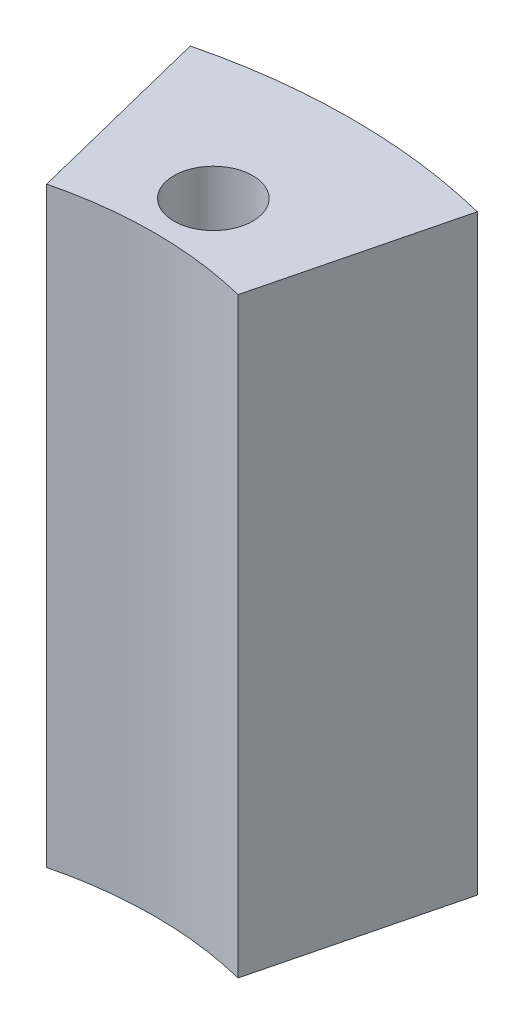
ISO-10303-21;
HEADER;
FILE_DESCRIPTION(('STEP AP214'),'2;1');
FILE_NAME('part.step','',(''),(''),'','','');
FILE_SCHEMA(('AUTOMOTIVE_DESIGN { 1 0 10303 214 1 1 1 1 }'));
ENDSEC;
DATA;
#1=APPLICATION_CONTEXT('core data for automotive mechanical design processes');
#2=APPLICATION_PROTOCOL_DEFINITION('international standard','automotive_design',2000,#1);
#3=PRODUCT_CONTEXT('',#1,'mechanical');
#4=PRODUCT('Part','Part','',(#3));
#5=PRODUCT_RELATED_PRODUCT_CATEGORY('part','',(#4));
#6=PRODUCT_DEFINITION_FORMATION('','',#4);
#7=PRODUCT_DEFINITION_CONTEXT('part definition',#1,'design');
#8=PRODUCT_DEFINITION('design','',#6,#7);
#9=PRODUCT_DEFINITION_SHAPE('','',#8);
#10=(LENGTH_UNIT() NAMED_UNIT(*) SI_UNIT(.MILLI.,.METRE.));
#11=(NAMED_UNIT(*) PLANE_ANGLE_UNIT() SI_UNIT($,.RADIAN.));
#12=(NAMED_UNIT(*) SI_UNIT($,.STERADIAN.) SOLID_ANGLE_UNIT());
#13=UNCERTAINTY_MEASURE_WITH_UNIT(LENGTH_MEASURE(1.E-05),#10,'distance_accuracy_value','');
#14=(GEOMETRIC_REPRESENTATION_CONTEXT(3) GLOBAL_UNCERTAINTY_ASSIGNED_CONTEXT((#13)) GLOBAL_UNIT_ASSIGNED_CONTEXT((#10,
#11,#12)) REPRESENTATION_CONTEXT('',''));
#15=CARTESIAN_POINT('',(0.,0.,0.));
#16=DIRECTION('',(0.,0.,1.));
#17=DIRECTION('',(1.,0.,0.));
#18=AXIS2_PLACEMENT_3D('',#15,#16,#17);
#19=CARTESIAN_POINT('',(0.,30.,0.));
#20=DIRECTION('',(0.,-1.,0.));
#21=DIRECTION('',(0.,0.,-1.));
#22=AXIS2_PLACEMENT_3D('',#19,#20,#21);
#23=CYLINDRICAL_SURFACE('',#22,20.);
#24=CARTESIAN_POINT('',(0.,0.,0.));
#25=DIRECTION('',(0.,-1.,0.));
#26=DIRECTION('',(0.,0.,1.));
#27=AXIS2_PLACEMENT_3D('',#24,#25,#26);
#28=CIRCLE('',#27,20.);
#29=CARTESIAN_POINT('',(-4.85071250072666,0.,-19.4028500029066));
#30=VERTEX_POINT('',#29);
#31=CARTESIAN_POINT('',(4.85071250072666,0.,-19.4028500029066));
#32=VERTEX_POINT('',#31);
#33=EDGE_CURVE('E100',#30,#32,#28,.T.);
#34=ORIENTED_EDGE('',*,*,#33,.T.);
#35=DIRECTION('',(0.,-1.,0.));
#36=VECTOR('',#35,1.);
#37=CARTESIAN_POINT('',(4.85071250072666,30.,-19.4028500029066));
#38=LINE('',#37,#36);
#39=CARTESIAN_POINT('',(4.85071250072666,30.,-19.4028500029066));
#40=VERTEX_POINT('',#39);
#41=EDGE_CURVE('E11',#40,#32,#38,.T.);
#42=ORIENTED_EDGE('',*,*,#41,.F.);
#43=CARTESIAN_POINT('',(0.,30.,0.));
#44=DIRECTION('',(0.,-1.,0.));
#45=DIRECTION('',(0.,0.,1.));
#46=AXIS2_PLACEMENT_3D('',#43,#44,#45);
#47=CIRCLE('',#46,20.);
#48=CARTESIAN_POINT('',(-4.85071250072666,30.,-19.4028500029066));
#49=VERTEX_POINT('',#48);
#50=EDGE_CURVE('E88',#49,#40,#47,.T.);
#51=ORIENTED_EDGE('',*,*,#50,.F.);
#52=DIRECTION('',(0.,-1.,0.));
#53=VECTOR('',#52,1.);
#54=CARTESIAN_POINT('',(-4.85071250072666,30.,-19.4028500029066));
#55=LINE('',#54,#53);
#56=EDGE_CURVE('E96',#49,#30,#55,.T.);
#57=ORIENTED_EDGE('',*,*,#56,.T.);
#58=EDGE_LOOP('',(#34,#42,#51,#57));
#59=FACE_BOUND('',#58,.T.);
#60=ADVANCED_FACE('F37',(#59),#23,.F.);
#61=CARTESIAN_POINT('',(4.85071250072666,30.,-19.4028500029066));
#62=DIRECTION('',(-0.970142500145332,0.,-0.242535625036333));
#63=DIRECTION('',(-0.242535625036333,0.,0.970142500145332));
#64=AXIS2_PLACEMENT_3D('',#61,#62,#63);
#65=PLANE('',#64);
#66=DIRECTION('',(0.242535625036333,0.,-0.970142500145332));
#67=VECTOR('',#66,1.);
#68=CARTESIAN_POINT('',(4.85071250072666,0.,-19.4028500029066));
#69=LINE('',#68,#67);
#70=CARTESIAN_POINT('',(7.27606875108998,0.,-29.10427500436));
#71=VERTEX_POINT('',#70);
#72=EDGE_CURVE('E92',#32,#71,#69,.T.);
#73=ORIENTED_EDGE('',*,*,#72,.T.);
#74=DIRECTION('',(0.,-1.,0.));
#75=VECTOR('',#74,1.);
#76=CARTESIAN_POINT('',(7.27606875108998,30.,-29.10427500436));
#77=LINE('',#76,#75);
#78=CARTESIAN_POINT('',(7.27606875108998,30.,-29.10427500436));
#79=VERTEX_POINT('',#78);
#80=EDGE_CURVE('E45',#79,#71,#77,.T.);
#81=ORIENTED_EDGE('',*,*,#80,.F.);
#82=DIRECTION('',(0.242535625036333,0.,-0.970142500145332));
#83=VECTOR('',#82,1.);
#84=CARTESIAN_POINT('',(4.85071250072666,30.,-19.4028500029066));
#85=LINE('',#84,#83);
#86=EDGE_CURVE('E83',#40,#79,#85,.T.);
#87=ORIENTED_EDGE('',*,*,#86,.F.);
#88=ORIENTED_EDGE('',*,*,#41,.T.);
#89=EDGE_LOOP('',(#73,#81,#87,#88));
#90=FACE_BOUND('',#89,.T.);
#91=ADVANCED_FACE('F91',(#90),#65,.F.);
#92=CARTESIAN_POINT('',(0.,30.,0.));
#93=DIRECTION('',(0.,-1.,0.));
#94=DIRECTION('',(0.,0.,-1.));
#95=AXIS2_PLACEMENT_3D('',#92,#93,#94);
#96=CYLINDRICAL_SURFACE('',#95,30.);
#97=CARTESIAN_POINT('',(0.,0.,0.));
#98=DIRECTION('',(0.,1.,0.));
#99=DIRECTION('',(0.,0.,1.));
#100=AXIS2_PLACEMENT_3D('',#97,#98,#99);
#101=CIRCLE('',#100,30.);
#102=CARTESIAN_POINT('',(-7.27606875108999,0.,-29.10427500436));
#103=VERTEX_POINT('',#102);
#104=EDGE_CURVE('E70',#71,#103,#101,.T.);
#105=ORIENTED_EDGE('',*,*,#104,.T.);
#106=DIRECTION('',(0.,-1.,0.));
#107=VECTOR('',#106,1.);
#108=CARTESIAN_POINT('',(-7.27606875108999,30.,-29.10427500436));
#109=LINE('',#108,#107);
#110=CARTESIAN_POINT('',(-7.27606875108999,30.,-29.10427500436));
#111=VERTEX_POINT('',#110);
#112=EDGE_CURVE('E93',#111,#103,#109,.T.);
#113=ORIENTED_EDGE('',*,*,#112,.F.);
#114=CARTESIAN_POINT('',(0.,30.,0.));
#115=DIRECTION('',(0.,1.,0.));
#116=DIRECTION('',(0.,0.,1.));
#117=AXIS2_PLACEMENT_3D('',#114,#115,#116);
#118=CIRCLE('',#117,30.);
#119=EDGE_CURVE('E86',#79,#111,#118,.T.);
#120=ORIENTED_EDGE('',*,*,#119,.F.);
#121=ORIENTED_EDGE('',*,*,#80,.T.);
#122=EDGE_LOOP('',(#105,#113,#120,#121));
#123=FACE_BOUND('',#122,.T.);
#124=ADVANCED_FACE('F94',(#123),#96,.T.);
#125=CARTESIAN_POINT('',(-4.85071250072666,30.,-19.4028500029066));
#126=DIRECTION('',(0.970142500145332,0.,-0.242535625036333));
#127=DIRECTION('',(-0.242535625036333,0.,-0.970142500145332));
#128=AXIS2_PLACEMENT_3D('',#125,#126,#127);
#129=PLANE('',#128);
#130=DIRECTION('',(0.242535625036333,0.,0.970142500145332));
#131=VECTOR('',#130,1.);
#132=CARTESIAN_POINT('',(-4.85071250072666,0.,-19.4028500029066));
#133=LINE('',#132,#131);
#134=EDGE_CURVE('E76',#103,#30,#133,.T.);
#135=ORIENTED_EDGE('',*,*,#134,.T.);
#136=ORIENTED_EDGE('',*,*,#56,.F.);
#137=DIRECTION('',(0.242535625036333,0.,0.970142500145332));
#138=VECTOR('',#137,1.);
#139=CARTESIAN_POINT('',(-4.85071250072666,30.,-19.4028500029066));
#140=LINE('',#139,#138);
#141=EDGE_CURVE('E53',#111,#49,#140,.T.);
#142=ORIENTED_EDGE('',*,*,#141,.F.);
#143=ORIENTED_EDGE('',*,*,#112,.T.);
#144=EDGE_LOOP('',(#135,#136,#142,#143));
#145=FACE_BOUND('',#144,.T.);
#146=ADVANCED_FACE('F108',(#145),#129,.F.);
#147=CARTESIAN_POINT('',(0.,30.,0.));
#148=DIRECTION('',(0.,1.,0.));
#149=DIRECTION('',(0.,0.,1.));
#150=AXIS2_PLACEMENT_3D('',#147,#148,#149);
#151=PLANE('',#150);
#152=CARTESIAN_POINT('',(0.,30.,-23.));
#153=DIRECTION('',(0.,1.,0.));
#154=DIRECTION('',(0.,0.,1.));
#155=AXIS2_PLACEMENT_3D('',#152,#153,#154);
#156=CIRCLE('',#155,2.);
#157=CARTESIAN_POINT('',(0.,30.,-21.));
#158=VERTEX_POINT('',#157);
#159=EDGE_CURVE('E120',#158,#158,#156,.T.);
#160=ORIENTED_EDGE('',*,*,#159,.F.);
#161=EDGE_LOOP('',(#160));
#162=FACE_BOUND('',#161,.T.);
#163=ORIENTED_EDGE('',*,*,#50,.T.);
#164=ORIENTED_EDGE('',*,*,#86,.T.);
#165=ORIENTED_EDGE('',*,*,#119,.T.);
#166=ORIENTED_EDGE('',*,*,#141,.T.);
#167=EDGE_LOOP('',(#163,#164,#165,#166));
#168=FACE_BOUND('',#167,.T.);
#169=ADVANCED_FACE('F84',(#162,#168),#151,.T.);
#170=CARTESIAN_POINT('',(0.,0.,0.));
#171=DIRECTION('',(0.,1.,0.));
#172=DIRECTION('',(0.,0.,1.));
#173=AXIS2_PLACEMENT_3D('',#170,#171,#172);
#174=PLANE('',#173);
#175=CARTESIAN_POINT('',(0.,0.,-25.0246930248654));
#176=DIRECTION('',(0.,-1.,0.));
#177=DIRECTION('',(0.,0.,-1.));
#178=AXIS2_PLACEMENT_3D('',#175,#176,#177);
#179=CIRCLE('',#178,1.5);
#180=CARTESIAN_POINT('',(0.,0.,-26.5246930248654));
#181=VERTEX_POINT('',#180);
#182=EDGE_CURVE('E114',#181,#181,#179,.T.);
#183=ORIENTED_EDGE('',*,*,#182,.F.);
#184=EDGE_LOOP('',(#183));
#185=FACE_BOUND('',#184,.T.);
#186=ORIENTED_EDGE('',*,*,#33,.F.);
#187=ORIENTED_EDGE('',*,*,#134,.F.);
#188=ORIENTED_EDGE('',*,*,#104,.F.);
#189=ORIENTED_EDGE('',*,*,#72,.F.);
#190=EDGE_LOOP('',(#186,#187,#188,#189));
#191=FACE_BOUND('',#190,.T.);
#192=ADVANCED_FACE('F111',(#185,#191),#174,.F.);
#193=CARTESIAN_POINT('',(0.,6.,-25.0246930248654));
#194=DIRECTION('',(0.,-1.,0.));
#195=DIRECTION('',(0.,0.,-1.));
#196=AXIS2_PLACEMENT_3D('',#193,#194,#195);
#197=CYLINDRICAL_SURFACE('',#196,1.5);
#198=CARTESIAN_POINT('',(0.,6.,-25.0246930248654));
#199=DIRECTION('',(0.,-1.,0.));
#200=DIRECTION('',(0.,0.,-1.));
#201=AXIS2_PLACEMENT_3D('',#198,#199,#200);
#202=CIRCLE('',#201,1.5);
#203=CARTESIAN_POINT('',(0.,6.,-26.5246930248654));
#204=VERTEX_POINT('',#203);
#205=EDGE_CURVE('E103',#204,#204,#202,.T.);
#206=ORIENTED_EDGE('',*,*,#205,.F.);
#207=EDGE_LOOP('',(#206));
#208=FACE_BOUND('',#207,.T.);
#209=ORIENTED_EDGE('',*,*,#182,.T.);
#210=EDGE_LOOP('',(#209));
#211=FACE_BOUND('',#210,.T.);
#212=ADVANCED_FACE('F141',(#208,#211),#197,.F.);
#213=CARTESIAN_POINT('',(0.,6.,-25.0246930248654));
#214=DIRECTION('',(0.,-1.,0.));
#215=DIRECTION('',(0.,0.,-1.));
#216=AXIS2_PLACEMENT_3D('',#213,#214,#215);
#217=PLANE('',#216);
#218=ORIENTED_EDGE('',*,*,#205,.T.);
#219=EDGE_LOOP('',(#218));
#220=FACE_BOUND('',#219,.T.);
#221=ADVANCED_FACE('F131',(#220),#217,.T.);
#222=CARTESIAN_POINT('',(0.,24.,-23.));
#223=DIRECTION('',(0.,1.,0.));
#224=DIRECTION('',(0.,0.,1.));
#225=AXIS2_PLACEMENT_3D('',#222,#223,#224);
#226=CYLINDRICAL_SURFACE('',#225,2.);
#227=CARTESIAN_POINT('',(0.,24.,-23.));
#228=DIRECTION('',(0.,1.,0.));
#229=DIRECTION('',(0.,0.,1.));
#230=AXIS2_PLACEMENT_3D('',#227,#228,#229);
#231=CIRCLE('',#230,2.);
#232=CARTESIAN_POINT('',(0.,24.,-21.));
#233=VERTEX_POINT('',#232);
#234=EDGE_CURVE('E117',#233,#233,#231,.T.);
#235=ORIENTED_EDGE('',*,*,#234,.F.);
#236=EDGE_LOOP('',(#235));
#237=FACE_BOUND('',#236,.T.);
#238=ORIENTED_EDGE('',*,*,#159,.T.);
#239=EDGE_LOOP('',(#238));
#240=FACE_BOUND('',#239,.T.);
#241=ADVANCED_FACE('F128',(#237,#240),#226,.F.);
#242=CARTESIAN_POINT('',(0.,24.,-23.));
#243=DIRECTION('',(0.,1.,0.));
#244=DIRECTION('',(0.,0.,1.));
#245=AXIS2_PLACEMENT_3D('',#242,#243,#244);
#246=PLANE('',#245);
#247=ORIENTED_EDGE('',*,*,#234,.T.);
#248=EDGE_LOOP('',(#247));
#249=FACE_BOUND('',#248,.T.);
#250=ADVANCED_FACE('F126',(#249),#246,.T.);
#251=CLOSED_SHELL('',(#60,#91,#124,#146,#169,#192,#212,#221,#241,#250));
#252=MANIFOLD_SOLID_BREP('B2',#251);
#253=ADVANCED_BREP_SHAPE_REPRESENTATION('',(#18,#252),#14);
#254=SHAPE_DEFINITION_REPRESENTATION(#9,#253);
ENDSEC;
END-ISO-10303-21;
